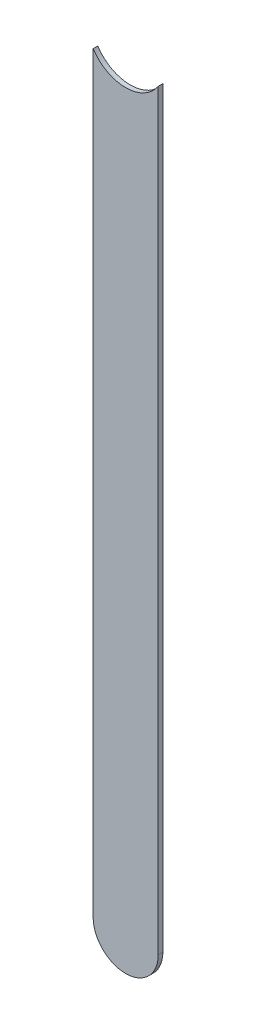
ISO-10303-21;
HEADER;
FILE_DESCRIPTION(('STEP AP214'),'2;1');
FILE_NAME('part.step','',(''),(''),'','','');
FILE_SCHEMA(('AUTOMOTIVE_DESIGN { 1 0 10303 214 1 1 1 1 }'));
ENDSEC;
DATA;
#1=APPLICATION_CONTEXT('core data for automotive mechanical design processes');
#2=APPLICATION_PROTOCOL_DEFINITION('international standard','automotive_design',2000,#1);
#3=PRODUCT_CONTEXT('',#1,'mechanical');
#4=PRODUCT('Part','Part','',(#3));
#5=PRODUCT_RELATED_PRODUCT_CATEGORY('part','',(#4));
#6=PRODUCT_DEFINITION_FORMATION('','',#4);
#7=PRODUCT_DEFINITION_CONTEXT('part definition',#1,'design');
#8=PRODUCT_DEFINITION('design','',#6,#7);
#9=PRODUCT_DEFINITION_SHAPE('','',#8);
#10=(LENGTH_UNIT() NAMED_UNIT(*) SI_UNIT(.MILLI.,.METRE.));
#11=(NAMED_UNIT(*) PLANE_ANGLE_UNIT() SI_UNIT($,.RADIAN.));
#12=(NAMED_UNIT(*) SI_UNIT($,.STERADIAN.) SOLID_ANGLE_UNIT());
#13=UNCERTAINTY_MEASURE_WITH_UNIT(LENGTH_MEASURE(1.E-05),#10,'distance_accuracy_value','');
#14=(GEOMETRIC_REPRESENTATION_CONTEXT(3) GLOBAL_UNCERTAINTY_ASSIGNED_CONTEXT((#13)) GLOBAL_UNIT_ASSIGNED_CONTEXT((#10,
#11,#12)) REPRESENTATION_CONTEXT('',''));
#15=CARTESIAN_POINT('',(0.,0.,0.));
#16=DIRECTION('',(0.,0.,1.));
#17=DIRECTION('',(1.,0.,0.));
#18=AXIS2_PLACEMENT_3D('',#15,#16,#17);
#19=CARTESIAN_POINT('',(106.3699803,98.3600268,0.));
#20=DIRECTION('',(-1.,0.,0.));
#21=DIRECTION('',(0.,1.,0.));
#22=AXIS2_PLACEMENT_3D('',#19,#20,#21);
#23=PLANE('',#22);
#24=DIRECTION('',(0.,1.,0.));
#25=VECTOR('',#24,1.);
#26=CARTESIAN_POINT('',(106.3699803,98.3600268,0.03556));
#27=LINE('',#26,#25);
#28=CARTESIAN_POINT('',(106.3699803,98.3600268,0.03556));
#29=VERTEX_POINT('',#28);
#30=CARTESIAN_POINT('',(106.3699803,104.134189092145,0.03556));
#31=VERTEX_POINT('',#30);
#32=EDGE_CURVE('E11',#29,#31,#27,.T.);
#33=ORIENTED_EDGE('',*,*,#32,.F.);
#34=DIRECTION('',(0.,0.,1.));
#35=VECTOR('',#34,1.);
#36=CARTESIAN_POINT('',(106.3699803,98.3600268,0.));
#37=LINE('',#36,#35);
#38=CARTESIAN_POINT('',(106.3699803,98.3600268,0.));
#39=VERTEX_POINT('',#38);
#40=EDGE_CURVE('E24',#39,#29,#37,.T.);
#41=ORIENTED_EDGE('',*,*,#40,.F.);
#42=DIRECTION('',(0.,1.,0.));
#43=VECTOR('',#42,1.);
#44=CARTESIAN_POINT('',(106.3699803,98.3600268,0.));
#45=LINE('',#44,#43);
#46=CARTESIAN_POINT('',(106.3699803,104.134189092145,0.));
#47=VERTEX_POINT('',#46);
#48=EDGE_CURVE('E75',#39,#47,#45,.T.);
#49=ORIENTED_EDGE('',*,*,#48,.T.);
#50=DIRECTION('',(0.,0.,1.));
#51=VECTOR('',#50,1.);
#52=CARTESIAN_POINT('',(106.3699803,104.134189092145,0.));
#53=LINE('',#52,#51);
#54=EDGE_CURVE('E37',#47,#31,#53,.T.);
#55=ORIENTED_EDGE('',*,*,#54,.T.);
#56=EDGE_LOOP('',(#33,#41,#49,#55));
#57=FACE_BOUND('',#56,.T.);
#58=ADVANCED_FACE('F17',(#57),#23,.F.);
#59=CARTESIAN_POINT('',(106.1199808,104.30002,0.));
#60=DIRECTION('',(0.,0.,-1.));
#61=DIRECTION('',(1.,0.,0.));
#62=AXIS2_PLACEMENT_3D('',#59,#60,#61);
#63=CYLINDRICAL_SURFACE('',#62,0.2999994);
#64=DIRECTION('',(0.,0.,1.));
#65=VECTOR('',#64,1.);
#66=CARTESIAN_POINT('',(105.8699813,104.134189092145,0.));
#67=LINE('',#66,#65);
#68=CARTESIAN_POINT('',(105.8699813,104.134189092145,0.));
#69=VERTEX_POINT('',#68);
#70=CARTESIAN_POINT('',(105.8699813,104.134189092145,0.03556));
#71=VERTEX_POINT('',#70);
#72=EDGE_CURVE('E67',#69,#71,#67,.T.);
#73=ORIENTED_EDGE('',*,*,#72,.T.);
#74=CARTESIAN_POINT('',(106.1199808,104.30002,0.03556));
#75=DIRECTION('',(0.,0.,1.));
#76=DIRECTION('',(1.,0.,0.));
#77=AXIS2_PLACEMENT_3D('',#74,#75,#76);
#78=CIRCLE('',#77,0.2999994);
#79=EDGE_CURVE('E82',#71,#31,#78,.T.);
#80=ORIENTED_EDGE('',*,*,#79,.T.);
#81=ORIENTED_EDGE('',*,*,#54,.F.);
#82=CARTESIAN_POINT('',(106.1199808,104.30002,0.));
#83=DIRECTION('',(0.,0.,1.));
#84=DIRECTION('',(1.,0.,0.));
#85=AXIS2_PLACEMENT_3D('',#82,#83,#84);
#86=CIRCLE('',#85,0.2999994);
#87=EDGE_CURVE('E80',#69,#47,#86,.T.);
#88=ORIENTED_EDGE('',*,*,#87,.F.);
#89=EDGE_LOOP('',(#73,#80,#81,#88));
#90=FACE_BOUND('',#89,.T.);
#91=ADVANCED_FACE('F88',(#90),#63,.F.);
#92=CARTESIAN_POINT('',(105.8699813,104.134189092145,0.));
#93=DIRECTION('',(1.,0.,0.));
#94=DIRECTION('',(0.,-1.,0.));
#95=AXIS2_PLACEMENT_3D('',#92,#93,#94);
#96=PLANE('',#95);
#97=DIRECTION('',(0.,-1.,0.));
#98=VECTOR('',#97,1.);
#99=CARTESIAN_POINT('',(105.8699813,104.30002,0.03556));
#100=LINE('',#99,#98);
#101=CARTESIAN_POINT('',(105.8699813,98.3600268,0.03556));
#102=VERTEX_POINT('',#101);
#103=EDGE_CURVE('E71',#71,#102,#100,.T.);
#104=ORIENTED_EDGE('',*,*,#103,.F.);
#105=ORIENTED_EDGE('',*,*,#72,.F.);
#106=DIRECTION('',(0.,-1.,0.));
#107=VECTOR('',#106,1.);
#108=CARTESIAN_POINT('',(105.8699813,104.30002,0.));
#109=LINE('',#108,#107);
#110=CARTESIAN_POINT('',(105.8699813,98.3600268,0.));
#111=VERTEX_POINT('',#110);
#112=EDGE_CURVE('E63',#69,#111,#109,.T.);
#113=ORIENTED_EDGE('',*,*,#112,.T.);
#114=DIRECTION('',(0.,0.,1.));
#115=VECTOR('',#114,1.);
#116=CARTESIAN_POINT('',(105.8699813,98.3600268,0.));
#117=LINE('',#116,#115);
#118=EDGE_CURVE('E53',#111,#102,#117,.T.);
#119=ORIENTED_EDGE('',*,*,#118,.T.);
#120=EDGE_LOOP('',(#104,#105,#113,#119));
#121=FACE_BOUND('',#120,.T.);
#122=ADVANCED_FACE('F66',(#121),#96,.F.);
#123=CARTESIAN_POINT('',(106.1199808,98.3600268,0.));
#124=DIRECTION('',(0.,0.,-1.));
#125=DIRECTION('',(-1.,-1.13687065095739E-13,0.));
#126=AXIS2_PLACEMENT_3D('',#123,#124,#125);
#127=CYLINDRICAL_SURFACE('',#126,0.249999500000016);
#128=CARTESIAN_POINT('',(106.1199808,98.3600268,0.03556));
#129=DIRECTION('',(0.,0.,1.));
#130=DIRECTION('',(-1.,-1.13687065095739E-13,0.));
#131=AXIS2_PLACEMENT_3D('',#128,#129,#130);
#132=CIRCLE('',#131,0.249999500000016);
#133=EDGE_CURVE('E59',#102,#29,#132,.T.);
#134=ORIENTED_EDGE('',*,*,#133,.F.);
#135=ORIENTED_EDGE('',*,*,#118,.F.);
#136=CARTESIAN_POINT('',(106.1199808,98.3600268,0.));
#137=DIRECTION('',(0.,0.,1.));
#138=DIRECTION('',(-1.,-1.13687065095739E-13,0.));
#139=AXIS2_PLACEMENT_3D('',#136,#137,#138);
#140=CIRCLE('',#139,0.249999500000016);
#141=EDGE_CURVE('E57',#111,#39,#140,.T.);
#142=ORIENTED_EDGE('',*,*,#141,.T.);
#143=ORIENTED_EDGE('',*,*,#40,.T.);
#144=EDGE_LOOP('',(#134,#135,#142,#143));
#145=FACE_BOUND('',#144,.T.);
#146=ADVANCED_FACE('F55',(#145),#127,.T.);
#147=CARTESIAN_POINT('',(106.3699803,98.3600268,0.));
#148=DIRECTION('',(0.,0.,-1.));
#149=DIRECTION('',(-1.,0.,0.));
#150=AXIS2_PLACEMENT_3D('',#147,#148,#149);
#151=PLANE('',#150);
#152=ORIENTED_EDGE('',*,*,#48,.F.);
#153=ORIENTED_EDGE('',*,*,#141,.F.);
#154=ORIENTED_EDGE('',*,*,#112,.F.);
#155=ORIENTED_EDGE('',*,*,#87,.T.);
#156=EDGE_LOOP('',(#152,#153,#154,#155));
#157=FACE_BOUND('',#156,.T.);
#158=ADVANCED_FACE('F74',(#157),#151,.T.);
#159=CARTESIAN_POINT('',(106.3699803,98.3600268,0.03556));
#160=DIRECTION('',(0.,0.,-1.));
#161=DIRECTION('',(-1.,0.,0.));
#162=AXIS2_PLACEMENT_3D('',#159,#160,#161);
#163=PLANE('',#162);
#164=ORIENTED_EDGE('',*,*,#133,.T.);
#165=ORIENTED_EDGE('',*,*,#32,.T.);
#166=ORIENTED_EDGE('',*,*,#79,.F.);
#167=ORIENTED_EDGE('',*,*,#103,.T.);
#168=EDGE_LOOP('',(#164,#165,#166,#167));
#169=FACE_BOUND('',#168,.T.);
#170=ADVANCED_FACE('F91',(#169),#163,.F.);
#171=CLOSED_SHELL('',(#58,#91,#122,#146,#158,#170));
#172=MANIFOLD_SOLID_BREP('B1',#171);
#173=ADVANCED_BREP_SHAPE_REPRESENTATION('',(#18,#172),#14);
#174=SHAPE_DEFINITION_REPRESENTATION(#9,#173);
ENDSEC;
END-ISO-10303-21;
